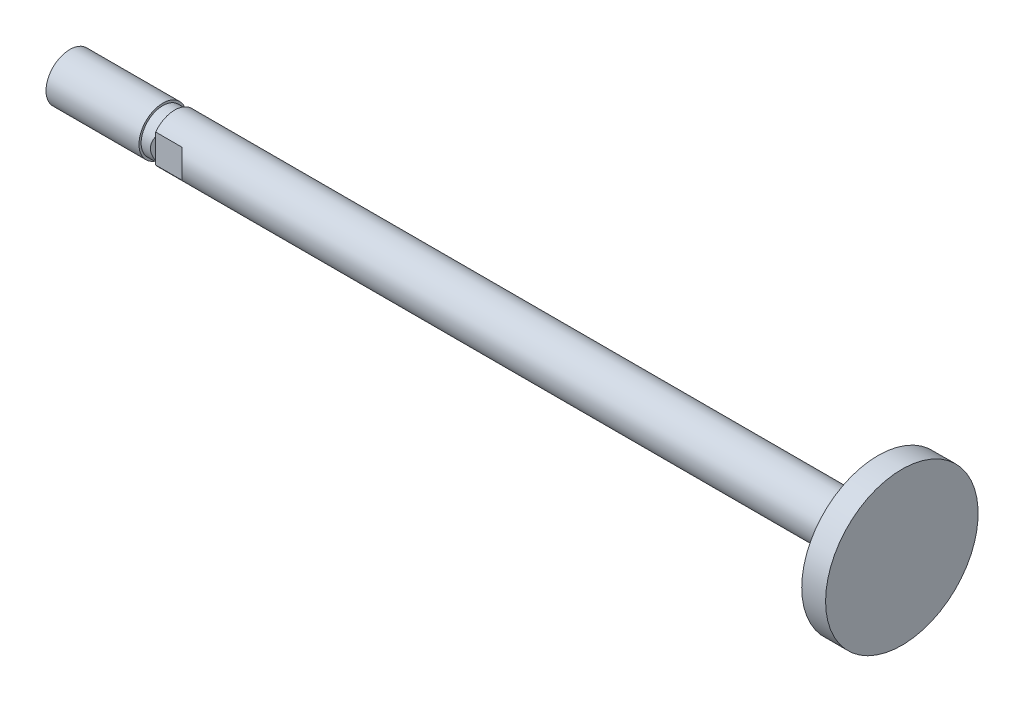
ISO-10303-21;
HEADER;
FILE_DESCRIPTION(('STEP AP214'),'2;1');
FILE_NAME('part.step','',(''),(''),'','','');
FILE_SCHEMA(('AUTOMOTIVE_DESIGN { 1 0 10303 214 1 1 1 1 }'));
ENDSEC;
DATA;
#1=APPLICATION_CONTEXT('core data for automotive mechanical design processes');
#2=APPLICATION_PROTOCOL_DEFINITION('international standard','automotive_design',2000,#1);
#3=PRODUCT_CONTEXT('',#1,'mechanical');
#4=PRODUCT('Part','Part','',(#3));
#5=PRODUCT_RELATED_PRODUCT_CATEGORY('part','',(#4));
#6=PRODUCT_DEFINITION_FORMATION('','',#4);
#7=PRODUCT_DEFINITION_CONTEXT('part definition',#1,'design');
#8=PRODUCT_DEFINITION('design','',#6,#7);
#9=PRODUCT_DEFINITION_SHAPE('','',#8);
#10=(LENGTH_UNIT() NAMED_UNIT(*) SI_UNIT(.MILLI.,.METRE.));
#11=(NAMED_UNIT(*) PLANE_ANGLE_UNIT() SI_UNIT($,.RADIAN.));
#12=(NAMED_UNIT(*) SI_UNIT($,.STERADIAN.) SOLID_ANGLE_UNIT());
#13=UNCERTAINTY_MEASURE_WITH_UNIT(LENGTH_MEASURE(1.E-05),#10,'distance_accuracy_value','');
#14=(GEOMETRIC_REPRESENTATION_CONTEXT(3) GLOBAL_UNCERTAINTY_ASSIGNED_CONTEXT((#13)) GLOBAL_UNIT_ASSIGNED_CONTEXT((#10,
#11,#12)) REPRESENTATION_CONTEXT('',''));
#15=CARTESIAN_POINT('',(0.,0.,0.));
#16=DIRECTION('',(0.,0.,1.));
#17=DIRECTION('',(1.,0.,0.));
#18=AXIS2_PLACEMENT_3D('',#15,#16,#17);
#19=CARTESIAN_POINT('',(-16.,-5.01018142226003,4.00000000000763));
#20=DIRECTION('',(-1.,0.,0.));
#21=DIRECTION('',(0.,1.,0.));
#22=AXIS2_PLACEMENT_3D('',#19,#20,#21);
#23=PLANE('',#22);
#24=DIRECTION('',(0.,-1.,0.));
#25=VECTOR('',#24,1.);
#26=CARTESIAN_POINT('',(-16.,-2.16852484422014,-4.));
#27=LINE('',#26,#25);
#28=CARTESIAN_POINT('',(-16.,-2.16852484422014,-4.));
#29=VERTEX_POINT('',#28);
#30=CARTESIAN_POINT('',(-16.,-3.,-4.));
#31=VERTEX_POINT('',#30);
#32=EDGE_CURVE('E91',#29,#31,#27,.T.);
#33=ORIENTED_EDGE('',*,*,#32,.T.);
#34=CARTESIAN_POINT('',(-16.,0.,0.));
#35=DIRECTION('',(-1.,0.,0.));
#36=DIRECTION('',(0.,-0.6,-0.8));
#37=AXIS2_PLACEMENT_3D('',#34,#35,#36);
#38=CIRCLE('',#37,5.);
#39=CARTESIAN_POINT('',(-16.,-3.,4.));
#40=VERTEX_POINT('',#39);
#41=EDGE_CURVE('E82',#40,#31,#38,.F.);
#42=ORIENTED_EDGE('',*,*,#41,.F.);
#43=DIRECTION('',(0.,1.,9.18007626034866E-12));
#44=VECTOR('',#43,1.);
#45=CARTESIAN_POINT('',(-16.,-3.,4.));
#46=LINE('',#45,#44);
#47=CARTESIAN_POINT('',(-16.,-2.16852484419198,4.00000000000763));
#48=VERTEX_POINT('',#47);
#49=EDGE_CURVE('E90',#48,#40,#46,.F.);
#50=ORIENTED_EDGE('',*,*,#49,.F.);
#51=CARTESIAN_POINT('',(-16.,0.,0.));
#52=DIRECTION('',(1.,0.,0.));
#53=DIRECTION('',(0.,-0.476598866856084,0.879120879123853));
#54=AXIS2_PLACEMENT_3D('',#51,#52,#53);
#55=CIRCLE('',#54,4.55);
#56=EDGE_CURVE('E103',#48,#29,#55,.T.);
#57=ORIENTED_EDGE('',*,*,#56,.T.);
#58=EDGE_LOOP('',(#33,#42,#50,#57));
#59=FACE_BOUND('',#58,.T.);
#60=ADVANCED_FACE('F17',(#59),#23,.T.);
#61=CARTESIAN_POINT('',(-16.,2.16852484422014,4.));
#62=DIRECTION('',(-1.,0.,0.));
#63=DIRECTION('',(0.,1.,0.));
#64=AXIS2_PLACEMENT_3D('',#61,#62,#63);
#65=PLANE('',#64);
#66=DIRECTION('',(0.,-1.,2.00393566035892E-12));
#67=VECTOR('',#66,1.);
#68=CARTESIAN_POINT('',(-16.,3.,-4.));
#69=LINE('',#68,#67);
#70=CARTESIAN_POINT('',(-16.,3.,-4.));
#71=VERTEX_POINT('',#70);
#72=CARTESIAN_POINT('',(-16.,2.16852484422628,-3.99999999999834));
#73=VERTEX_POINT('',#72);
#74=EDGE_CURVE('E114',#71,#73,#69,.T.);
#75=ORIENTED_EDGE('',*,*,#74,.T.);
#76=CARTESIAN_POINT('',(-16.,0.,0.));
#77=DIRECTION('',(1.,0.,0.));
#78=DIRECTION('',(0.,0.476598866862766,-0.879120879120231));
#79=AXIS2_PLACEMENT_3D('',#76,#77,#78);
#80=CIRCLE('',#79,4.55);
#81=CARTESIAN_POINT('',(-16.,2.16852484422014,4.));
#82=VERTEX_POINT('',#81);
#83=EDGE_CURVE('E119',#73,#82,#80,.T.);
#84=ORIENTED_EDGE('',*,*,#83,.T.);
#85=DIRECTION('',(0.,1.,0.));
#86=VECTOR('',#85,1.);
#87=CARTESIAN_POINT('',(-16.,2.16852484422015,4.));
#88=LINE('',#87,#86);
#89=CARTESIAN_POINT('',(-16.,3.,4.));
#90=VERTEX_POINT('',#89);
#91=EDGE_CURVE('E124',#90,#82,#88,.F.);
#92=ORIENTED_EDGE('',*,*,#91,.F.);
#93=CARTESIAN_POINT('',(-16.,0.,0.));
#94=DIRECTION('',(-1.,0.,0.));
#95=DIRECTION('',(0.,0.6,0.8));
#96=AXIS2_PLACEMENT_3D('',#93,#94,#95);
#97=CIRCLE('',#96,5.);
#98=EDGE_CURVE('E129',#71,#90,#97,.F.);
#99=ORIENTED_EDGE('',*,*,#98,.F.);
#100=EDGE_LOOP('',(#75,#84,#92,#99));
#101=FACE_BOUND('',#100,.T.);
#102=ADVANCED_FACE('F368',(#101),#65,.T.);
#103=CARTESIAN_POINT('',(-38.,-5.,5.));
#104=DIRECTION('',(-1.,0.,0.));
#105=DIRECTION('',(0.,1.,0.));
#106=AXIS2_PLACEMENT_3D('',#103,#104,#105);
#107=PLANE('',#106);
#108=CARTESIAN_POINT('',(-38.,0.,0.));
#109=DIRECTION('',(-1.,0.,0.));
#110=DIRECTION('',(0.,0.,-1.));
#111=AXIS2_PLACEMENT_3D('',#108,#109,#110);
#112=CIRCLE('',#111,5.);
#113=CARTESIAN_POINT('',(-38.,0.,-5.));
#114=VERTEX_POINT('',#113);
#115=EDGE_CURVE('E133',#114,#114,#112,.F.);
#116=ORIENTED_EDGE('',*,*,#115,.F.);
#117=EDGE_LOOP('',(#116));
#118=FACE_BOUND('',#117,.T.);
#119=ADVANCED_FACE('F373',(#118),#107,.T.);
#120=CARTESIAN_POINT('',(-18.5,-4.99999975829996,-5.00000000000001));
#121=DIRECTION('',(1.,0.,0.));
#122=DIRECTION('',(0.,1.,0.));
#123=AXIS2_PLACEMENT_3D('',#120,#121,#122);
#124=PLANE('',#123);
#125=CARTESIAN_POINT('',(-18.5,0.,0.));
#126=DIRECTION('',(1.,0.,0.));
#127=DIRECTION('',(0.,-1.41721898572201E-07,0.99999999999999));
#128=AXIS2_PLACEMENT_3D('',#125,#126,#127);
#129=CIRCLE('',#128,5.);
#130=CARTESIAN_POINT('',(-18.5,-7.08609492861005E-07,4.99999999999995));
#131=VERTEX_POINT('',#130);
#132=EDGE_CURVE('E138',#131,#131,#129,.T.);
#133=ORIENTED_EDGE('',*,*,#132,.T.);
#134=EDGE_LOOP('',(#133));
#135=FACE_BOUND('',#134,.T.);
#136=CARTESIAN_POINT('',(-18.5,0.,0.));
#137=DIRECTION('',(-1.,0.,0.));
#138=DIRECTION('',(0.,0.,-1.));
#139=AXIS2_PLACEMENT_3D('',#136,#137,#138);
#140=CIRCLE('',#139,4.55);
#141=CARTESIAN_POINT('',(-18.5,0.,-4.55));
#142=VERTEX_POINT('',#141);
#143=EDGE_CURVE('E141',#142,#142,#140,.F.);
#144=ORIENTED_EDGE('',*,*,#143,.F.);
#145=EDGE_LOOP('',(#144));
#146=FACE_BOUND('',#145,.T.);
#147=ADVANCED_FACE('F379',(#135,#146),#124,.T.);
#148=CARTESIAN_POINT('',(131.5,-16.2972214998846,16.));
#149=DIRECTION('',(-1.,0.,0.));
#150=DIRECTION('',(0.,1.,0.));
#151=AXIS2_PLACEMENT_3D('',#148,#149,#150);
#152=PLANE('',#151);
#153=CARTESIAN_POINT('',(131.5,0.,0.));
#154=DIRECTION('',(-1.,0.,0.));
#155=DIRECTION('',(0.,0.,-1.));
#156=AXIS2_PLACEMENT_3D('',#153,#154,#155);
#157=CIRCLE('',#156,16.);
#158=CARTESIAN_POINT('',(131.5,0.,-16.));
#159=VERTEX_POINT('',#158);
#160=EDGE_CURVE('E144',#159,#159,#157,.F.);
#161=ORIENTED_EDGE('',*,*,#160,.F.);
#162=EDGE_LOOP('',(#161));
#163=FACE_BOUND('',#162,.T.);
#164=CARTESIAN_POINT('',(131.5,0.,0.));
#165=DIRECTION('',(1.,0.,0.));
#166=DIRECTION('',(0.,-1.42053902152386E-07,0.99999999999999));
#167=AXIS2_PLACEMENT_3D('',#164,#165,#166);
#168=CIRCLE('',#167,5.);
#169=CARTESIAN_POINT('',(131.5,-7.10269510761928E-07,4.99999999999995));
#170=VERTEX_POINT('',#169);
#171=EDGE_CURVE('E147',#170,#170,#168,.T.);
#172=ORIENTED_EDGE('',*,*,#171,.T.);
#173=EDGE_LOOP('',(#172));
#174=FACE_BOUND('',#173,.T.);
#175=ADVANCED_FACE('F382',(#163,#174),#152,.T.);
#176=CARTESIAN_POINT('',(136.5,-16.2972214998846,-16.));
#177=DIRECTION('',(1.,0.,0.));
#178=DIRECTION('',(0.,1.,0.));
#179=AXIS2_PLACEMENT_3D('',#176,#177,#178);
#180=PLANE('',#179);
#181=CARTESIAN_POINT('',(136.5,0.,0.));
#182=DIRECTION('',(1.,0.,0.));
#183=DIRECTION('',(0.,0.,1.));
#184=AXIS2_PLACEMENT_3D('',#181,#182,#183);
#185=CIRCLE('',#184,16.);
#186=CARTESIAN_POINT('',(136.5,0.,16.));
#187=VERTEX_POINT('',#186);
#188=EDGE_CURVE('E150',#187,#187,#185,.T.);
#189=ORIENTED_EDGE('',*,*,#188,.T.);
#190=EDGE_LOOP('',(#189));
#191=FACE_BOUND('',#190,.T.);
#192=ADVANCED_FACE('F176',(#191),#180,.T.);
#193=CARTESIAN_POINT('',(-16.5500000000007,-2.16852484424269,4.55000000000068));
#194=DIRECTION('',(0.707106781186548,0.,0.707106781186548));
#195=DIRECTION('',(0.707106781186548,0.,-0.707106781186548));
#196=AXIS2_PLACEMENT_3D('',#193,#194,#195);
#197=PLANE('',#196);
#198=CARTESIAN_POINT('',(-16.549999999998,1.42746058029442E-11,4.54999999999805));
#199=CARTESIAN_POINT('',(-16.5499999999986,-0.110732000005405,4.54999999999858));
#200=CARTESIAN_POINT('',(-16.546024189984,-0.220471335858634,4.54602418998402));
#201=CARTESIAN_POINT('',(-16.5289558435188,-0.456905404934893,4.52895584351881));
#202=CARTESIAN_POINT('',(-16.5145343887019,-0.581753891476928,4.51453438870187));
#203=CARTESIAN_POINT('',(-16.4703224214288,-0.863283933386863,4.47032242142878));
#204=CARTESIAN_POINT('',(-16.4384856210619,-1.01239324372186,4.43848562106188));
#205=CARTESIAN_POINT('',(-16.3303263063313,-1.42350958112601,4.33032630633127));
#206=CARTESIAN_POINT('',(-16.244145426183,-1.65829201758569,4.24414542618298));
#207=CARTESIAN_POINT('',(-16.0996206981412,-1.97693419693893,4.09962069814119));
#208=CARTESIAN_POINT('',(-16.0513016562634,-2.07389525044136,4.05130165626341));
#209=CARTESIAN_POINT('',(-16.,-2.16852484419198,4.));
#210=B_SPLINE_CURVE_WITH_KNOTS('',3,(#198,#199,#200,#201,#202,#203,#204,#205,#206,#207,#208,
#209),.UNSPECIFIED.,.F.,.F.,(4,2,2,2,2,4),(0.,0.130311172644253,0.283254426111679,
0.48022584793077,0.837749248595319,1.),.UNSPECIFIED.);
#211=CARTESIAN_POINT('',(-16.5499999999977,1.42744134834547E-11,4.5499999999987));
#212=VERTEX_POINT('',#211);
#213=EDGE_CURVE('E153',#212,#48,#210,.T.);
#214=ORIENTED_EDGE('',*,*,#213,.T.);
#215=DIRECTION('',(0.,1.,0.));
#216=VECTOR('',#215,1.);
#217=CARTESIAN_POINT('',(-16.,-2.16852484419198,4.));
#218=LINE('',#217,#216);
#219=EDGE_CURVE('E163',#82,#48,#218,.F.);
#220=ORIENTED_EDGE('',*,*,#219,.F.);
#221=CARTESIAN_POINT('',(-16.,2.16852484422015,4.));
#222=CARTESIAN_POINT('',(-16.0501045459208,2.07610340657373,4.05010454592084));
#223=CARTESIAN_POINT('',(-16.0973640504017,1.98145804764477,4.09736405040171));
#224=CARTESIAN_POINT('',(-16.2464036695757,1.65433115793993,4.24640366957568));
#225=CARTESIAN_POINT('',(-16.3373602527227,1.4064029359927,4.33736025272265));
#226=CARTESIAN_POINT('',(-16.4464098524798,0.976445179038794,4.44640985247981));
#227=CARTESIAN_POINT('',(-16.4763117628877,0.830757518271791,4.4763117628877));
#228=CARTESIAN_POINT('',(-16.515365724658,0.571664215762058,4.51536572465803));
#229=CARTESIAN_POINT('',(-16.5280045047466,0.463867160864153,4.52800450474656));
#230=CARTESIAN_POINT('',(-16.545321642417,0.239559723349517,4.54532164241696));
#231=CARTESIAN_POINT('',(-16.5499999999988,0.123049340732785,4.54999999999883));
#232=CARTESIAN_POINT('',(-16.549999999998,1.42746058029442E-11,4.54999999999805));
#233=B_SPLINE_CURVE_WITH_KNOTS('',3,(#221,#222,#223,#224,#225,#226,#227,#228,#229,#230,#231,
#232),.UNSPECIFIED.,.F.,.F.,(4,2,2,2,2,4),(0.,0.162478181973275,0.547772974022943,
0.738067787323339,0.869033893661669,1.),.UNSPECIFIED.);
#234=EDGE_CURVE('E316',#82,#212,#233,.T.);
#235=ORIENTED_EDGE('',*,*,#234,.T.);
#236=EDGE_LOOP('',(#214,#220,#235));
#237=FACE_BOUND('',#236,.T.);
#238=ADVANCED_FACE('F165',(#237),#197,.T.);
#239=CARTESIAN_POINT('',(-10.5000000000112,-3.00000000001982,3.99999999998885));
#240=DIRECTION('',(-0.707106781186548,0.,0.707106781186548));
#241=DIRECTION('',(0.707106781186548,0.,0.707106781186548));
#242=AXIS2_PLACEMENT_3D('',#239,#240,#241);
#243=PLANE('',#242);
#244=CARTESIAN_POINT('',(-9.5,0.,5.));
#245=CARTESIAN_POINT('',(-9.50000000000031,0.159327419308164,4.99999999999969));
#246=CARTESIAN_POINT('',(-9.50741779807602,0.316353898808209,4.99258220192398));
#247=CARTESIAN_POINT('',(-9.53814579627952,0.643354348971199,4.96185420372048));
#248=CARTESIAN_POINT('',(-9.56314580020414,0.812804156427734,4.93685419979586));
#249=CARTESIAN_POINT('',(-9.63803016948683,1.1865920374557,4.86196983051317));
#250=CARTESIAN_POINT('',(-9.69100964500302,1.38366115685008,4.80899035499697));
#251=CARTESIAN_POINT('',(-9.88387669536691,1.96465034233601,4.61612330463309));
#252=CARTESIAN_POINT('',(-10.0447874020379,2.29864717053455,4.45521259796212));
#253=CARTESIAN_POINT('',(-10.3116839880498,2.73560724553026,4.18831601195022));
#254=CARTESIAN_POINT('',(-10.4026480585448,2.87019741138906,4.09735194145524));
#255=CARTESIAN_POINT('',(-10.4999999999696,2.99999999995949,4.00000000003038));
#256=B_SPLINE_CURVE_WITH_KNOTS('',3,(#244,#245,#246,#247,#248,#249,#250,#251,#252,#253,#254,
#255),.UNSPECIFIED.,.F.,.F.,(4,2,2,2,2,4),(0.,0.133821129740707,0.282657533502771,
0.467280258973002,0.83673735161997,1.),.UNSPECIFIED.);
#257=CARTESIAN_POINT('',(-9.5,0.,5.));
#258=VERTEX_POINT('',#257);
#259=CARTESIAN_POINT('',(-10.4999999999696,2.99999999995949,4.00000000003038));
#260=VERTEX_POINT('',#259);
#261=EDGE_CURVE('E196',#258,#260,#256,.T.);
#262=ORIENTED_EDGE('',*,*,#261,.T.);
#263=DIRECTION('',(-6.92275866263988E-12,-1.,-6.92261063290326E-12));
#264=VECTOR('',#263,1.);
#265=CARTESIAN_POINT('',(-10.4999999999696,2.99999999995949,4.00000000003038));
#266=LINE('',#265,#264);
#267=CARTESIAN_POINT('',(-10.5000000000112,-3.00000000001983,3.99999999998885));
#268=VERTEX_POINT('',#267);
#269=EDGE_CURVE('E201',#260,#268,#266,.T.);
#270=ORIENTED_EDGE('',*,*,#269,.T.);
#271=CARTESIAN_POINT('',(-10.5000000000112,-3.00000000001982,3.99999999998885));
#272=CARTESIAN_POINT('',(-10.4084552051539,-2.87794027354775,4.09154479484611));
#273=CARTESIAN_POINT('',(-10.3227606980411,-2.75189608165596,4.17723930195894));
#274=CARTESIAN_POINT('',(-10.0459569159135,-2.30471818769787,4.45404308408654));
#275=CARTESIAN_POINT('',(-9.87213324603846,-1.94630896206718,4.62786675396154));
#276=CARTESIAN_POINT('',(-9.67418000358811,-1.32349572841507,4.82581999641189));
#277=CARTESIAN_POINT('',(-9.62404521957993,-1.12744495061245,4.87595478042006));
#278=CARTESIAN_POINT('',(-9.55818655163322,-0.77753409928815,4.94181344836678));
#279=CARTESIAN_POINT('',(-9.53679908755109,-0.629041249730457,4.96320091244891));
#280=CARTESIAN_POINT('',(-9.50770581173396,-0.322510574173601,4.99229418826604));
#281=CARTESIAN_POINT('',(-9.49999999999898,-0.164472748174437,5.00000000000102));
#282=CARTESIAN_POINT('',(-9.5,0.,5.));
#283=B_SPLINE_CURVE_WITH_KNOTS('',3,(#271,#272,#273,#274,#275,#276,#277,#278,#279,#280,#281,
#282),.UNSPECIFIED.,.F.,.F.,(4,2,2,2,2,4),(0.,0.157567775424897,0.564265308320952,
0.744198909416186,0.872099454708093,1.),.UNSPECIFIED.);
#284=EDGE_CURVE('E208',#268,#258,#283,.T.);
#285=ORIENTED_EDGE('',*,*,#284,.T.);
#286=EDGE_LOOP('',(#262,#270,#285));
#287=FACE_BOUND('',#286,.T.);
#288=ADVANCED_FACE('F175',(#287),#243,.T.);
#289=CARTESIAN_POINT('',(-16.,-3.00000000001982,4.));
#290=DIRECTION('',(0.,0.,1.));
#291=DIRECTION('',(1.,0.,0.));
#292=AXIS2_PLACEMENT_3D('',#289,#290,#291);
#293=PLANE('',#292);
#294=DIRECTION('',(1.,-3.60438951413825E-12,0.));
#295=VECTOR('',#294,1.);
#296=CARTESIAN_POINT('',(-16.,-3.,4.));
#297=LINE('',#296,#295);
#298=EDGE_CURVE('E85',#40,#268,#297,.T.);
#299=ORIENTED_EDGE('',*,*,#298,.T.);
#300=ORIENTED_EDGE('',*,*,#269,.F.);
#301=DIRECTION('',(-1.,7.36719776089374E-12,0.));
#302=VECTOR('',#301,1.);
#303=CARTESIAN_POINT('',(-10.4999999999696,2.99999999995948,4.));
#304=LINE('',#303,#302);
#305=EDGE_CURVE('E221',#260,#90,#304,.T.);
#306=ORIENTED_EDGE('',*,*,#305,.T.);
#307=ORIENTED_EDGE('',*,*,#91,.T.);
#308=ORIENTED_EDGE('',*,*,#219,.T.);
#309=ORIENTED_EDGE('',*,*,#49,.T.);
#310=EDGE_LOOP('',(#299,#300,#306,#307,#308,#309));
#311=FACE_BOUND('',#310,.T.);
#312=ADVANCED_FACE('F248',(#311),#293,.T.);
#313=CARTESIAN_POINT('',(-15.9999999999967,-2.16852484422014,-3.99999999999667));
#314=DIRECTION('',(0.707106781186548,0.,-0.707106781186548));
#315=DIRECTION('',(-0.707106781186548,0.,-0.707106781186548));
#316=AXIS2_PLACEMENT_3D('',#313,#314,#315);
#317=PLANE('',#316);
#318=CARTESIAN_POINT('',(-16.55,0.,-4.55));
#319=CARTESIAN_POINT('',(-16.5500000000005,0.110732000020117,-4.55000000000046));
#320=CARTESIAN_POINT('',(-16.5460241899858,0.220471335873798,-4.54602418998581));
#321=CARTESIAN_POINT('',(-16.5289558435204,0.456905404951132,-4.52895584352041));
#322=CARTESIAN_POINT('',(-16.5145343887033,0.581753891493836,-4.51453438870335));
#323=CARTESIAN_POINT('',(-16.4703224214299,0.863283933405545,-4.47032242142994));
#324=CARTESIAN_POINT('',(-16.4384856210628,1.0123932437417,-4.43848562106283));
#325=CARTESIAN_POINT('',(-16.3303263063315,1.42350958114959,-4.33032630633155));
#326=CARTESIAN_POINT('',(-16.2441454261827,1.65829201761212,-4.24414542618274));
#327=CARTESIAN_POINT('',(-16.0996206981401,1.97693419697004,-4.0996206981401));
#328=CARTESIAN_POINT('',(-16.051301656262,2.07389525047401,-4.05130165626205));
#329=CARTESIAN_POINT('',(-15.9999999999983,2.16852484422628,-3.99999999999834));
#330=B_SPLINE_CURVE_WITH_KNOTS('',3,(#318,#319,#320,#321,#322,#323,#324,#325,#326,#327,#328,
#329),.UNSPECIFIED.,.F.,.F.,(4,2,2,2,2,4),(0.,0.130311172644253,0.283254426111677,
0.480225847930766,0.83774924859531,1.),.UNSPECIFIED.);
#331=CARTESIAN_POINT('',(-16.55,0.,-4.55));
#332=VERTEX_POINT('',#331);
#333=EDGE_CURVE('E226',#332,#73,#330,.T.);
#334=ORIENTED_EDGE('',*,*,#333,.T.);
#335=DIRECTION('',(-3.83364296265238E-13,-1.,-3.83569084885038E-13));
#336=VECTOR('',#335,1.);
#337=CARTESIAN_POINT('',(-15.9999999999983,2.16852484422628,-3.99999999999834));
#338=LINE('',#337,#336);
#339=EDGE_CURVE('E237',#73,#29,#338,.T.);
#340=ORIENTED_EDGE('',*,*,#339,.T.);
#341=CARTESIAN_POINT('',(-16.,-2.16852484422014,-4.));
#342=CARTESIAN_POINT('',(-16.050104545921,-2.07610340657259,-4.050104545921));
#343=CARTESIAN_POINT('',(-16.097364050402,-1.98145804764256,-4.09736405040201));
#344=CARTESIAN_POINT('',(-16.2464036695764,-1.65433115793428,-4.24640366957645));
#345=CARTESIAN_POINT('',(-16.3373602527237,-1.40640293598493,-4.33736025272372));
#346=CARTESIAN_POINT('',(-16.4464098524812,-0.97644517902832,-4.44640985248124));
#347=CARTESIAN_POINT('',(-16.4763117628892,-0.830757518260543,-4.47631176288924));
#348=CARTESIAN_POINT('',(-16.5153657246597,-0.571664215749678,-4.51536572465973));
#349=CARTESIAN_POINT('',(-16.5280045047483,-0.463867160851358,-4.52800450474831));
#350=CARTESIAN_POINT('',(-16.5453216424188,-0.239559723335947,-4.54532164241882));
#351=CARTESIAN_POINT('',(-16.5500000000007,-0.123049340718856,-4.55000000000074));
#352=CARTESIAN_POINT('',(-16.55,0.,-4.55));
#353=B_SPLINE_CURVE_WITH_KNOTS('',3,(#341,#342,#343,#344,#345,#346,#347,#348,#349,#350,#351,
#352),.UNSPECIFIED.,.F.,.F.,(4,2,2,2,2,4),(0.,0.162478181973278,0.547772974022945,
0.73806778732334,0.86903389366167,1.),.UNSPECIFIED.);
#354=EDGE_CURVE('E263',#29,#332,#353,.T.);
#355=ORIENTED_EDGE('',*,*,#354,.T.);
#356=EDGE_LOOP('',(#334,#340,#355));
#357=FACE_BOUND('',#356,.T.);
#358=ADVANCED_FACE('F239',(#357),#317,.T.);
#359=CARTESIAN_POINT('',(-10.4999999999882,-3.,-4.));
#360=DIRECTION('',(0.,0.,-1.));
#361=DIRECTION('',(-1.,0.,0.));
#362=AXIS2_PLACEMENT_3D('',#359,#360,#361);
#363=PLANE('',#362);
#364=DIRECTION('',(1.,1.14704205730509E-12,0.));
#365=VECTOR('',#364,1.);
#366=CARTESIAN_POINT('',(-16.,3.,-4.));
#367=LINE('',#366,#365);
#368=CARTESIAN_POINT('',(-10.5000000000418,3.00000000000631,-4.));
#369=VERTEX_POINT('',#368);
#370=EDGE_CURVE('E256',#71,#369,#367,.T.);
#371=ORIENTED_EDGE('',*,*,#370,.T.);
#372=DIRECTION('',(8.9451409242873E-12,-1.,0.));
#373=VECTOR('',#372,1.);
#374=CARTESIAN_POINT('',(-10.5000000000418,3.00000000000631,-4.));
#375=LINE('',#374,#373);
#376=CARTESIAN_POINT('',(-10.4999999999882,-2.99999999998423,-4.));
#377=VERTEX_POINT('',#376);
#378=EDGE_CURVE('E99',#369,#377,#375,.T.);
#379=ORIENTED_EDGE('',*,*,#378,.T.);
#380=DIRECTION('',(-1.,-2.86720142577124E-12,0.));
#381=VECTOR('',#380,1.);
#382=CARTESIAN_POINT('',(-10.4999999999882,-2.99999999998423,-4.));
#383=LINE('',#382,#381);
#384=EDGE_CURVE('E41',#377,#31,#383,.T.);
#385=ORIENTED_EDGE('',*,*,#384,.T.);
#386=ORIENTED_EDGE('',*,*,#32,.F.);
#387=ORIENTED_EDGE('',*,*,#339,.F.);
#388=ORIENTED_EDGE('',*,*,#74,.F.);
#389=EDGE_LOOP('',(#371,#379,#385,#386,#387,#388));
#390=FACE_BOUND('',#389,.T.);
#391=ADVANCED_FACE('F97',(#390),#363,.T.);
#392=CARTESIAN_POINT('',(-9.50000000000994,-2.99999999998423,-4.99999999999006));
#393=DIRECTION('',(-0.707106781186548,0.,-0.707106781186548));
#394=DIRECTION('',(-0.707106781186548,0.,0.707106781186548));
#395=AXIS2_PLACEMENT_3D('',#392,#393,#394);
#396=PLANE('',#395);
#397=CARTESIAN_POINT('',(-9.50000000001097,-5.75451145068406E-12,-4.99999999998903));
#398=CARTESIAN_POINT('',(-9.50000000001151,-0.159327419314353,-4.99999999998849));
#399=CARTESIAN_POINT('',(-9.50741779808747,-0.316353898814839,-4.99258220191253));
#400=CARTESIAN_POINT('',(-9.53814579629154,-0.643354348978846,-4.96185420370846));
#401=CARTESIAN_POINT('',(-9.5631458002165,-0.812804156435992,-4.9368541997835));
#402=CARTESIAN_POINT('',(-9.63803016950007,-1.18659203746554,-4.86196983049993));
#403=CARTESIAN_POINT('',(-9.69100964501682,-1.38366115686092,-4.80899035498318));
#404=CARTESIAN_POINT('',(-9.88387669538265,-1.96465034235036,-4.61612330461735));
#405=CARTESIAN_POINT('',(-10.0447874020552,-2.29864717055166,-4.45521259794485));
#406=CARTESIAN_POINT('',(-10.3116839880695,-2.73560724555186,-4.18831601193046));
#407=CARTESIAN_POINT('',(-10.4026480585654,-2.8701974114122,-4.09735194143462));
#408=CARTESIAN_POINT('',(-10.4999999999911,-2.99999999998423,-4.00000000000887));
#409=B_SPLINE_CURVE_WITH_KNOTS('',3,(#397,#398,#399,#400,#401,#402,#403,#404,#405,#406,#407,
#408),.UNSPECIFIED.,.F.,.F.,(4,2,2,2,2,4),(0.,0.133821129740708,0.282657533502775,
0.46728025897301,0.836737351619979,1.),.UNSPECIFIED.);
#410=CARTESIAN_POINT('',(-9.5000000000128,-5.75580437525653E-12,-4.99999999999269));
#411=VERTEX_POINT('',#410);
#412=EDGE_CURVE('E28',#411,#377,#409,.T.);
#413=ORIENTED_EDGE('',*,*,#412,.T.);
#414=ORIENTED_EDGE('',*,*,#378,.F.);
#415=CARTESIAN_POINT('',(-10.5000000000221,3.00000000000631,-3.9999999999779));
#416=CARTESIAN_POINT('',(-10.4084552051648,2.87794027353484,-4.09154479483516));
#417=CARTESIAN_POINT('',(-10.322760698052,2.75189608164366,-4.17723930194798));
#418=CARTESIAN_POINT('',(-10.0459569159244,2.30471818768745,-4.45404308407558));
#419=CARTESIAN_POINT('',(-9.87213324604941,1.94630896205798,-4.62786675395059));
#420=CARTESIAN_POINT('',(-9.67418000359907,1.32349572840734,-4.82581999640093));
#421=CARTESIAN_POINT('',(-9.62404521959089,1.12744495060511,-4.87595478040911));
#422=CARTESIAN_POINT('',(-9.55818655164418,0.777534099281396,-4.94181344835582));
#423=CARTESIAN_POINT('',(-9.53679908756205,0.629041249723923,-4.96320091243795));
#424=CARTESIAN_POINT('',(-9.50770581174493,0.322510574167473,-4.99229418825507));
#425=CARTESIAN_POINT('',(-9.50000000000994,0.164472748168498,-4.99999999999006));
#426=CARTESIAN_POINT('',(-9.50000000001097,-5.75451145068406E-12,-4.99999999998903));
#427=B_SPLINE_CURVE_WITH_KNOTS('',3,(#415,#416,#417,#418,#419,#420,#421,#422,#423,#424,#425,
#426),.UNSPECIFIED.,.F.,.F.,(4,2,2,2,2,4),(0.,0.157567775424913,0.56426530832096,
0.744198909416191,0.872099454708095,1.),.UNSPECIFIED.);
#428=EDGE_CURVE('E11',#369,#411,#427,.T.);
#429=ORIENTED_EDGE('',*,*,#428,.T.);
#430=EDGE_LOOP('',(#413,#414,#429));
#431=FACE_BOUND('',#430,.T.);
#432=ADVANCED_FACE('F275',(#431),#396,.T.);
#433=CARTESIAN_POINT('',(136.5,0.,0.));
#434=DIRECTION('',(1.,0.,0.));
#435=DIRECTION('',(0.,2.45458212715126E-11,1.));
#436=AXIS2_PLACEMENT_3D('',#433,#434,#435);
#437=CYLINDRICAL_SURFACE('',#436,4.55);
#438=ORIENTED_EDGE('',*,*,#143,.T.);
#439=EDGE_LOOP('',(#438));
#440=FACE_BOUND('',#439,.T.);
#441=ORIENTED_EDGE('',*,*,#354,.F.);
#442=ORIENTED_EDGE('',*,*,#56,.F.);
#443=ORIENTED_EDGE('',*,*,#213,.F.);
#444=ORIENTED_EDGE('',*,*,#234,.F.);
#445=ORIENTED_EDGE('',*,*,#83,.F.);
#446=ORIENTED_EDGE('',*,*,#333,.F.);
#447=EDGE_LOOP('',(#441,#442,#443,#444,#445,#446));
#448=FACE_BOUND('',#447,.T.);
#449=ADVANCED_FACE('F284',(#440,#448),#437,.T.);
#450=CARTESIAN_POINT('',(136.5,0.,0.));
#451=DIRECTION('',(1.,0.,0.));
#452=DIRECTION('',(0.,0.,1.));
#453=AXIS2_PLACEMENT_3D('',#450,#451,#452);
#454=CYLINDRICAL_SURFACE('',#453,5.);
#455=ORIENTED_EDGE('',*,*,#171,.F.);
#456=EDGE_LOOP('',(#455));
#457=FACE_BOUND('',#456,.T.);
#458=ORIENTED_EDGE('',*,*,#284,.F.);
#459=ORIENTED_EDGE('',*,*,#298,.F.);
#460=ORIENTED_EDGE('',*,*,#41,.T.);
#461=ORIENTED_EDGE('',*,*,#384,.F.);
#462=ORIENTED_EDGE('',*,*,#412,.F.);
#463=ORIENTED_EDGE('',*,*,#428,.F.);
#464=ORIENTED_EDGE('',*,*,#370,.F.);
#465=ORIENTED_EDGE('',*,*,#98,.T.);
#466=ORIENTED_EDGE('',*,*,#305,.F.);
#467=ORIENTED_EDGE('',*,*,#261,.F.);
#468=EDGE_LOOP('',(#458,#459,#460,#461,#462,#463,#464,#465,#466,#467));
#469=FACE_BOUND('',#468,.T.);
#470=ADVANCED_FACE('F83',(#457,#469),#454,.T.);
#471=CARTESIAN_POINT('',(136.5,0.,0.));
#472=DIRECTION('',(1.,0.,0.));
#473=DIRECTION('',(0.,0.,1.));
#474=AXIS2_PLACEMENT_3D('',#471,#472,#473);
#475=CYLINDRICAL_SURFACE('',#474,5.);
#476=ORIENTED_EDGE('',*,*,#132,.F.);
#477=EDGE_LOOP('',(#476));
#478=FACE_BOUND('',#477,.T.);
#479=ORIENTED_EDGE('',*,*,#115,.T.);
#480=EDGE_LOOP('',(#479));
#481=FACE_BOUND('',#480,.T.);
#482=ADVANCED_FACE('F346',(#478,#481),#475,.T.);
#483=CARTESIAN_POINT('',(136.5,0.,0.));
#484=DIRECTION('',(1.,0.,0.));
#485=DIRECTION('',(0.,0.,1.));
#486=AXIS2_PLACEMENT_3D('',#483,#484,#485);
#487=CYLINDRICAL_SURFACE('',#486,16.);
#488=ORIENTED_EDGE('',*,*,#188,.F.);
#489=EDGE_LOOP('',(#488));
#490=FACE_BOUND('',#489,.T.);
#491=ORIENTED_EDGE('',*,*,#160,.T.);
#492=EDGE_LOOP('',(#491));
#493=FACE_BOUND('',#492,.T.);
#494=ADVANCED_FACE('F19',(#490,#493),#487,.T.);
#495=CLOSED_SHELL('',(#60,#102,#119,#147,#175,#192,#238,#288,#312,#358,#391,#432,#449,#470,#482,#494));
#496=MANIFOLD_SOLID_BREP('B1',#495);
#497=ADVANCED_BREP_SHAPE_REPRESENTATION('',(#18,#496),#14);
#498=SHAPE_DEFINITION_REPRESENTATION(#9,#497);
ENDSEC;
END-ISO-10303-21;
